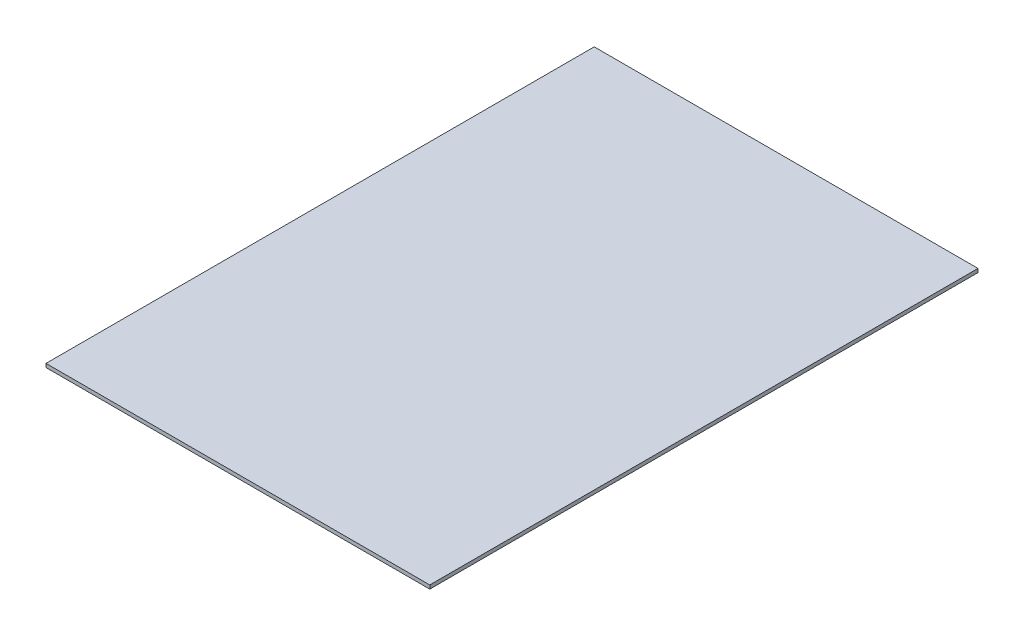
ISO-10303-21;
HEADER;
FILE_DESCRIPTION(('STEP AP214'),'2;1');
FILE_NAME('part.step','',(''),(''),'','','');
FILE_SCHEMA(('AUTOMOTIVE_DESIGN { 1 0 10303 214 1 1 1 1 }'));
ENDSEC;
DATA;
#1=APPLICATION_CONTEXT('core data for automotive mechanical design processes');
#2=APPLICATION_PROTOCOL_DEFINITION('international standard','automotive_design',2000,#1);
#3=PRODUCT_CONTEXT('',#1,'mechanical');
#4=PRODUCT('Part','Part','',(#3));
#5=PRODUCT_RELATED_PRODUCT_CATEGORY('part','',(#4));
#6=PRODUCT_DEFINITION_FORMATION('','',#4);
#7=PRODUCT_DEFINITION_CONTEXT('part definition',#1,'design');
#8=PRODUCT_DEFINITION('design','',#6,#7);
#9=PRODUCT_DEFINITION_SHAPE('','',#8);
#10=(LENGTH_UNIT() NAMED_UNIT(*) SI_UNIT(.MILLI.,.METRE.));
#11=(NAMED_UNIT(*) PLANE_ANGLE_UNIT() SI_UNIT($,.RADIAN.));
#12=(NAMED_UNIT(*) SI_UNIT($,.STERADIAN.) SOLID_ANGLE_UNIT());
#13=UNCERTAINTY_MEASURE_WITH_UNIT(LENGTH_MEASURE(1.E-05),#10,'distance_accuracy_value','');
#14=(GEOMETRIC_REPRESENTATION_CONTEXT(3) GLOBAL_UNCERTAINTY_ASSIGNED_CONTEXT((#13)) GLOBAL_UNIT_ASSIGNED_CONTEXT((#10,
#11,#12)) REPRESENTATION_CONTEXT('',''));
#15=CARTESIAN_POINT('',(0.,0.,0.));
#16=DIRECTION('',(0.,0.,1.));
#17=DIRECTION('',(1.,0.,0.));
#18=AXIS2_PLACEMENT_3D('',#15,#16,#17);
#19=CARTESIAN_POINT('',(21.,10.,0.));
#20=DIRECTION('',(-1.,0.,0.));
#21=DIRECTION('',(0.,0.,1.));
#22=AXIS2_PLACEMENT_3D('',#19,#20,#21);
#23=PLANE('',#22);
#24=DIRECTION('',(0.,1.,0.));
#25=VECTOR('',#24,1.);
#26=CARTESIAN_POINT('',(21.,10.,95.));
#27=LINE('',#26,#25);
#28=CARTESIAN_POINT('',(21.,10.,95.));
#29=VERTEX_POINT('',#28);
#30=CARTESIAN_POINT('',(21.,10.2,95.));
#31=VERTEX_POINT('',#30);
#32=EDGE_CURVE('E11',#29,#31,#27,.T.);
#33=ORIENTED_EDGE('',*,*,#32,.F.);
#34=DIRECTION('',(0.,0.,1.));
#35=VECTOR('',#34,1.);
#36=CARTESIAN_POINT('',(21.,10.,0.));
#37=LINE('',#36,#35);
#38=CARTESIAN_POINT('',(21.,10.,65.));
#39=VERTEX_POINT('',#38);
#40=EDGE_CURVE('E88',#29,#39,#37,.F.);
#41=ORIENTED_EDGE('',*,*,#40,.T.);
#42=DIRECTION('',(0.,1.,0.));
#43=VECTOR('',#42,1.);
#44=CARTESIAN_POINT('',(21.,10.,65.));
#45=LINE('',#44,#43);
#46=CARTESIAN_POINT('',(21.,10.2,65.));
#47=VERTEX_POINT('',#46);
#48=EDGE_CURVE('E43',#39,#47,#45,.T.);
#49=ORIENTED_EDGE('',*,*,#48,.T.);
#50=DIRECTION('',(0.,0.,1.));
#51=VECTOR('',#50,1.);
#52=CARTESIAN_POINT('',(21.,10.2,0.));
#53=LINE('',#52,#51);
#54=EDGE_CURVE('E101',#31,#47,#53,.F.);
#55=ORIENTED_EDGE('',*,*,#54,.F.);
#56=EDGE_LOOP('',(#33,#41,#49,#55));
#57=FACE_BOUND('',#56,.T.);
#58=ADVANCED_FACE('F33',(#57),#23,.F.);
#59=CARTESIAN_POINT('',(0.,10.,65.));
#60=DIRECTION('',(0.,0.,1.));
#61=DIRECTION('',(1.,0.,0.));
#62=AXIS2_PLACEMENT_3D('',#59,#60,#61);
#63=PLANE('',#62);
#64=ORIENTED_EDGE('',*,*,#48,.F.);
#65=DIRECTION('',(1.,0.,0.));
#66=VECTOR('',#65,1.);
#67=CARTESIAN_POINT('',(0.,10.,65.));
#68=LINE('',#67,#66);
#69=CARTESIAN_POINT('',(0.,10.,65.));
#70=VERTEX_POINT('',#69);
#71=EDGE_CURVE('E95',#39,#70,#68,.F.);
#72=ORIENTED_EDGE('',*,*,#71,.T.);
#73=DIRECTION('',(0.,1.,0.));
#74=VECTOR('',#73,1.);
#75=CARTESIAN_POINT('',(0.,10.,65.));
#76=LINE('',#75,#74);
#77=CARTESIAN_POINT('',(0.,10.2,65.));
#78=VERTEX_POINT('',#77);
#79=EDGE_CURVE('E51',#70,#78,#76,.T.);
#80=ORIENTED_EDGE('',*,*,#79,.T.);
#81=DIRECTION('',(1.,0.,0.));
#82=VECTOR('',#81,1.);
#83=CARTESIAN_POINT('',(0.,10.2,65.));
#84=LINE('',#83,#82);
#85=EDGE_CURVE('E82',#47,#78,#84,.F.);
#86=ORIENTED_EDGE('',*,*,#85,.F.);
#87=EDGE_LOOP('',(#64,#72,#80,#86));
#88=FACE_BOUND('',#87,.T.);
#89=ADVANCED_FACE('F105',(#88),#63,.F.);
#90=CARTESIAN_POINT('',(0.,10.,0.));
#91=DIRECTION('',(-1.,0.,0.));
#92=DIRECTION('',(0.,0.,1.));
#93=AXIS2_PLACEMENT_3D('',#90,#91,#92);
#94=PLANE('',#93);
#95=ORIENTED_EDGE('',*,*,#79,.F.);
#96=DIRECTION('',(0.,0.,1.));
#97=VECTOR('',#96,1.);
#98=CARTESIAN_POINT('',(0.,10.,0.));
#99=LINE('',#98,#97);
#100=CARTESIAN_POINT('',(0.,10.,95.));
#101=VERTEX_POINT('',#100);
#102=EDGE_CURVE('E87',#101,#70,#99,.F.);
#103=ORIENTED_EDGE('',*,*,#102,.F.);
#104=DIRECTION('',(0.,1.,0.));
#105=VECTOR('',#104,1.);
#106=CARTESIAN_POINT('',(0.,10.,95.));
#107=LINE('',#106,#105);
#108=CARTESIAN_POINT('',(0.,10.2,95.));
#109=VERTEX_POINT('',#108);
#110=EDGE_CURVE('E37',#101,#109,#107,.T.);
#111=ORIENTED_EDGE('',*,*,#110,.T.);
#112=DIRECTION('',(0.,0.,1.));
#113=VECTOR('',#112,1.);
#114=CARTESIAN_POINT('',(0.,10.2,0.));
#115=LINE('',#114,#113);
#116=EDGE_CURVE('E97',#109,#78,#115,.F.);
#117=ORIENTED_EDGE('',*,*,#116,.T.);
#118=EDGE_LOOP('',(#95,#103,#111,#117));
#119=FACE_BOUND('',#118,.T.);
#120=ADVANCED_FACE('F90',(#119),#94,.T.);
#121=CARTESIAN_POINT('',(0.,10.,95.));
#122=DIRECTION('',(0.,0.,1.));
#123=DIRECTION('',(1.,0.,0.));
#124=AXIS2_PLACEMENT_3D('',#121,#122,#123);
#125=PLANE('',#124);
#126=DIRECTION('',(1.,0.,0.));
#127=VECTOR('',#126,1.);
#128=CARTESIAN_POINT('',(0.,10.,95.));
#129=LINE('',#128,#127);
#130=EDGE_CURVE('E76',#101,#29,#129,.T.);
#131=ORIENTED_EDGE('',*,*,#130,.T.);
#132=ORIENTED_EDGE('',*,*,#32,.T.);
#133=DIRECTION('',(1.,0.,0.));
#134=VECTOR('',#133,1.);
#135=CARTESIAN_POINT('',(0.,10.2,95.));
#136=LINE('',#135,#134);
#137=EDGE_CURVE('E78',#109,#31,#136,.T.);
#138=ORIENTED_EDGE('',*,*,#137,.F.);
#139=ORIENTED_EDGE('',*,*,#110,.F.);
#140=EDGE_LOOP('',(#131,#132,#138,#139));
#141=FACE_BOUND('',#140,.T.);
#142=ADVANCED_FACE('F35',(#141),#125,.T.);
#143=CARTESIAN_POINT('',(0.,10.2,0.));
#144=DIRECTION('',(0.,1.,0.));
#145=DIRECTION('',(0.,0.,1.));
#146=AXIS2_PLACEMENT_3D('',#143,#144,#145);
#147=PLANE('',#146);
#148=ORIENTED_EDGE('',*,*,#116,.F.);
#149=ORIENTED_EDGE('',*,*,#137,.T.);
#150=ORIENTED_EDGE('',*,*,#54,.T.);
#151=ORIENTED_EDGE('',*,*,#85,.T.);
#152=EDGE_LOOP('',(#148,#149,#150,#151));
#153=FACE_BOUND('',#152,.T.);
#154=ADVANCED_FACE('F104',(#153),#147,.T.);
#155=CARTESIAN_POINT('',(0.,10.,0.));
#156=DIRECTION('',(0.,1.,0.));
#157=DIRECTION('',(0.,0.,1.));
#158=AXIS2_PLACEMENT_3D('',#155,#156,#157);
#159=PLANE('',#158);
#160=ORIENTED_EDGE('',*,*,#102,.T.);
#161=ORIENTED_EDGE('',*,*,#71,.F.);
#162=ORIENTED_EDGE('',*,*,#40,.F.);
#163=ORIENTED_EDGE('',*,*,#130,.F.);
#164=EDGE_LOOP('',(#160,#161,#162,#163));
#165=FACE_BOUND('',#164,.T.);
#166=ADVANCED_FACE('F85',(#165),#159,.F.);
#167=CLOSED_SHELL('',(#58,#89,#120,#142,#154,#166));
#168=MANIFOLD_SOLID_BREP('B2',#167);
#169=ADVANCED_BREP_SHAPE_REPRESENTATION('',(#18,#168),#14);
#170=SHAPE_DEFINITION_REPRESENTATION(#9,#169);
ENDSEC;
END-ISO-10303-21;
